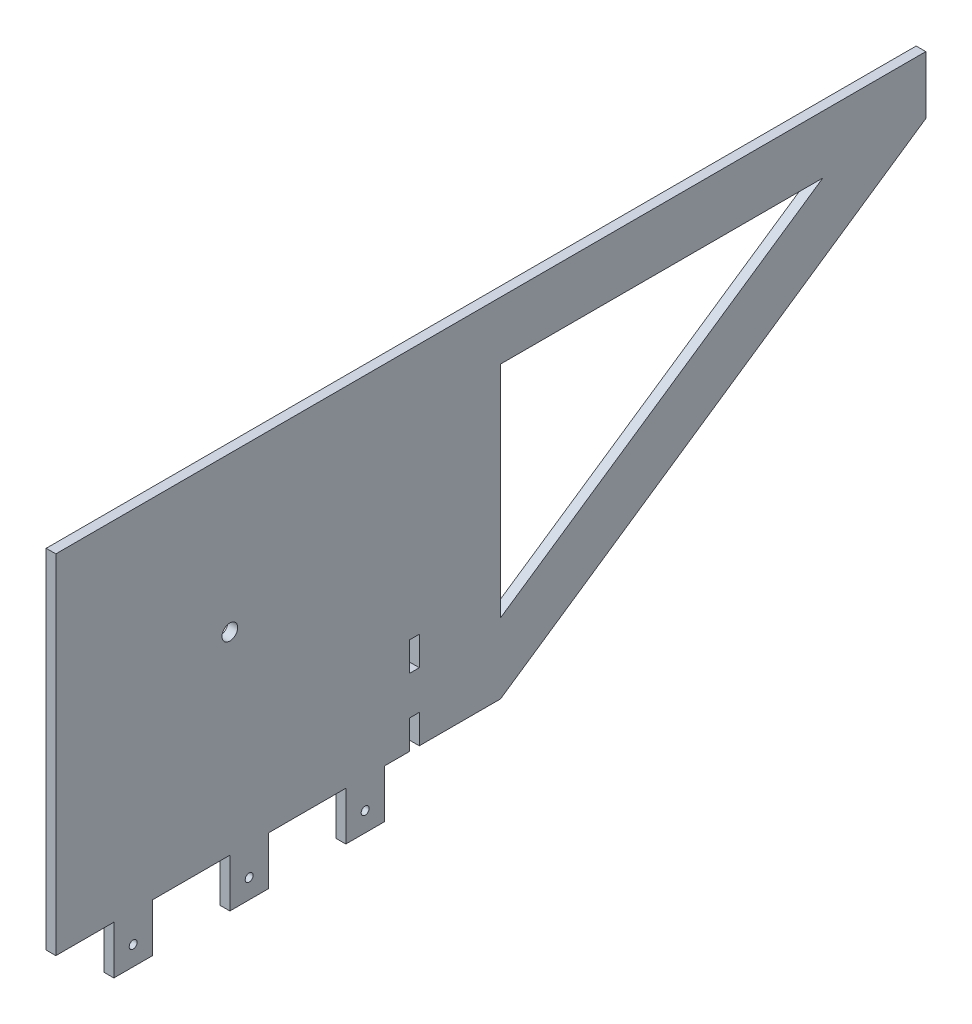
ISO-10303-21;
HEADER;
FILE_DESCRIPTION(('STEP AP214'),'2;1');
FILE_NAME('part.step','',(''),(''),'','','');
FILE_SCHEMA(('AUTOMOTIVE_DESIGN { 1 0 10303 214 1 1 1 1 }'));
ENDSEC;
DATA;
#1=APPLICATION_CONTEXT('core data for automotive mechanical design processes');
#2=APPLICATION_PROTOCOL_DEFINITION('international standard','automotive_design',2000,#1);
#3=PRODUCT_CONTEXT('',#1,'mechanical');
#4=PRODUCT('Part','Part','',(#3));
#5=PRODUCT_RELATED_PRODUCT_CATEGORY('part','',(#4));
#6=PRODUCT_DEFINITION_FORMATION('','',#4);
#7=PRODUCT_DEFINITION_CONTEXT('part definition',#1,'design');
#8=PRODUCT_DEFINITION('design','',#6,#7);
#9=PRODUCT_DEFINITION_SHAPE('','',#8);
#10=(LENGTH_UNIT() NAMED_UNIT(*) SI_UNIT(.MILLI.,.METRE.));
#11=(NAMED_UNIT(*) PLANE_ANGLE_UNIT() SI_UNIT($,.RADIAN.));
#12=(NAMED_UNIT(*) SI_UNIT($,.STERADIAN.) SOLID_ANGLE_UNIT());
#13=UNCERTAINTY_MEASURE_WITH_UNIT(LENGTH_MEASURE(1.E-05),#10,'distance_accuracy_value','');
#14=(GEOMETRIC_REPRESENTATION_CONTEXT(3) GLOBAL_UNCERTAINTY_ASSIGNED_CONTEXT((#13)) GLOBAL_UNIT_ASSIGNED_CONTEXT((#10,
#11,#12)) REPRESENTATION_CONTEXT('',''));
#15=CARTESIAN_POINT('',(0.,0.,0.));
#16=DIRECTION('',(0.,0.,1.));
#17=DIRECTION('',(1.,0.,0.));
#18=AXIS2_PLACEMENT_3D('',#15,#16,#17);
#19=CARTESIAN_POINT('',(5.,-90.,-100.));
#20=DIRECTION('',(0.,1.,0.));
#21=DIRECTION('',(0.,0.,1.));
#22=AXIS2_PLACEMENT_3D('',#19,#20,#21);
#23=PLANE('',#22);
#24=DIRECTION('',(0.,0.,-1.));
#25=VECTOR('',#24,1.);
#26=CARTESIAN_POINT('',(0.,-90.,-100.));
#27=LINE('',#26,#25);
#28=CARTESIAN_POINT('',(0.,-90.,-70.0000000000001));
#29=VERTEX_POINT('',#28);
#30=CARTESIAN_POINT('',(0.,-90.,-83.));
#31=VERTEX_POINT('',#30);
#32=EDGE_CURVE('E416',#29,#31,#27,.T.);
#33=ORIENTED_EDGE('',*,*,#32,.T.);
#34=DIRECTION('',(1.,0.,0.));
#35=VECTOR('',#34,1.);
#36=CARTESIAN_POINT('',(0.,-90.,-83.));
#37=LINE('',#36,#35);
#38=CARTESIAN_POINT('',(5.,-90.,-83.));
#39=VERTEX_POINT('',#38);
#40=EDGE_CURVE('E319',#31,#39,#37,.T.);
#41=ORIENTED_EDGE('',*,*,#40,.T.);
#42=DIRECTION('',(0.,0.,-1.));
#43=VECTOR('',#42,1.);
#44=CARTESIAN_POINT('',(5.,-90.,-100.));
#45=LINE('',#44,#43);
#46=CARTESIAN_POINT('',(5.,-90.,-70.0000000000001));
#47=VERTEX_POINT('',#46);
#48=EDGE_CURVE('E383',#47,#39,#45,.T.);
#49=ORIENTED_EDGE('',*,*,#48,.F.);
#50=DIRECTION('',(-1.,0.,0.));
#51=VECTOR('',#50,1.);
#52=CARTESIAN_POINT('',(5.,-90.,-70.0000000000001));
#53=LINE('',#52,#51);
#54=EDGE_CURVE('E422',#47,#29,#53,.T.);
#55=ORIENTED_EDGE('',*,*,#54,.T.);
#56=EDGE_LOOP('',(#33,#41,#49,#55));
#57=FACE_BOUND('',#56,.T.);
#58=ADVANCED_FACE('F39',(#57),#23,.F.);
#59=CARTESIAN_POINT('',(5.,0.,0.));
#60=DIRECTION('',(-1.,0.,0.));
#61=DIRECTION('',(0.,0.,1.));
#62=AXIS2_PLACEMENT_3D('',#59,#60,#61);
#63=PLANE('',#62);
#64=DIRECTION('',(0.,0.,-1.));
#65=VECTOR('',#64,1.);
#66=CARTESIAN_POINT('',(5.,-55.,-83.));
#67=LINE('',#66,#65);
#68=CARTESIAN_POINT('',(5.,-55.,-83.));
#69=VERTEX_POINT('',#68);
#70=CARTESIAN_POINT('',(5.,-55.,-88.));
#71=VERTEX_POINT('',#70);
#72=EDGE_CURVE('E292',#69,#71,#67,.T.);
#73=ORIENTED_EDGE('',*,*,#72,.F.);
#74=DIRECTION('',(0.,-1.,0.));
#75=VECTOR('',#74,1.);
#76=CARTESIAN_POINT('',(5.,-40.,-83.));
#77=LINE('',#76,#75);
#78=CARTESIAN_POINT('',(5.,-40.,-83.));
#79=VERTEX_POINT('',#78);
#80=EDGE_CURVE('E55',#79,#69,#77,.T.);
#81=ORIENTED_EDGE('',*,*,#80,.F.);
#82=DIRECTION('',(0.,0.,1.));
#83=VECTOR('',#82,1.);
#84=CARTESIAN_POINT('',(5.,-40.,-83.));
#85=LINE('',#84,#83);
#86=CARTESIAN_POINT('',(5.,-40.,-88.));
#87=VERTEX_POINT('',#86);
#88=EDGE_CURVE('E283',#87,#79,#85,.T.);
#89=ORIENTED_EDGE('',*,*,#88,.F.);
#90=DIRECTION('',(0.,1.,0.));
#91=VECTOR('',#90,1.);
#92=CARTESIAN_POINT('',(5.,-40.,-88.));
#93=LINE('',#92,#91);
#94=EDGE_CURVE('E296',#71,#87,#93,.T.);
#95=ORIENTED_EDGE('',*,*,#94,.F.);
#96=EDGE_LOOP('',(#73,#81,#89,#95));
#97=FACE_BOUND('',#96,.T.);
#98=CARTESIAN_POINT('',(5.,10.,9.99999999999999));
#99=DIRECTION('',(1.,0.,0.));
#100=DIRECTION('',(0.,0.,-1.));
#101=AXIS2_PLACEMENT_3D('',#98,#99,#100);
#102=CIRCLE('',#101,4.05);
#103=CARTESIAN_POINT('',(5.,10.,5.94999999999999));
#104=VERTEX_POINT('',#103);
#105=EDGE_CURVE('E303',#104,#104,#102,.T.);
#106=ORIENTED_EDGE('',*,*,#105,.F.);
#107=EDGE_LOOP('',(#106));
#108=FACE_BOUND('',#107,.T.);
#109=ORIENTED_EDGE('',*,*,#48,.T.);
#110=DIRECTION('',(0.,-1.,0.));
#111=VECTOR('',#110,1.);
#112=CARTESIAN_POINT('',(5.,-75.,-83.));
#113=LINE('',#112,#111);
#114=CARTESIAN_POINT('',(5.,-75.,-83.));
#115=VERTEX_POINT('',#114);
#116=EDGE_CURVE('E274',#115,#39,#113,.T.);
#117=ORIENTED_EDGE('',*,*,#116,.F.);
#118=DIRECTION('',(0.,0.,1.));
#119=VECTOR('',#118,1.);
#120=CARTESIAN_POINT('',(5.,-75.,-83.));
#121=LINE('',#120,#119);
#122=CARTESIAN_POINT('',(5.,-75.,-88.));
#123=VERTEX_POINT('',#122);
#124=EDGE_CURVE('E313',#123,#115,#121,.T.);
#125=ORIENTED_EDGE('',*,*,#124,.F.);
#126=DIRECTION('',(0.,1.,0.));
#127=VECTOR('',#126,1.);
#128=CARTESIAN_POINT('',(5.,-75.,-88.));
#129=LINE('',#128,#127);
#130=CARTESIAN_POINT('',(5.,-90.,-88.));
#131=VERTEX_POINT('',#130);
#132=EDGE_CURVE('E321',#131,#123,#129,.T.);
#133=ORIENTED_EDGE('',*,*,#132,.F.);
#134=CARTESIAN_POINT('',(5.,-90.,-130.));
#135=VERTEX_POINT('',#134);
#136=EDGE_CURVE('E382',#131,#135,#45,.T.);
#137=ORIENTED_EDGE('',*,*,#136,.T.);
#138=DIRECTION('',(0.,-0.56333682464151,0.826227342807548));
#139=VECTOR('',#138,1.);
#140=CARTESIAN_POINT('',(5.,60.,-350.));
#141=LINE('',#140,#139);
#142=CARTESIAN_POINT('',(5.,60.,-350.));
#143=VERTEX_POINT('',#142);
#144=EDGE_CURVE('E262',#143,#135,#141,.T.);
#145=ORIENTED_EDGE('',*,*,#144,.F.);
#146=DIRECTION('',(0.,-1.,0.));
#147=VECTOR('',#146,1.);
#148=CARTESIAN_POINT('',(5.,90.,-350.));
#149=LINE('',#148,#147);
#150=CARTESIAN_POINT('',(5.,90.,-350.));
#151=VERTEX_POINT('',#150);
#152=EDGE_CURVE('E259',#151,#143,#149,.T.);
#153=ORIENTED_EDGE('',*,*,#152,.F.);
#154=DIRECTION('',(0.,0.,1.));
#155=VECTOR('',#154,1.);
#156=CARTESIAN_POINT('',(5.,90.,-100.));
#157=LINE('',#156,#155);
#158=CARTESIAN_POINT('',(5.,90.,100.));
#159=VERTEX_POINT('',#158);
#160=EDGE_CURVE('E386',#151,#159,#157,.T.);
#161=ORIENTED_EDGE('',*,*,#160,.T.);
#162=DIRECTION('',(0.,-1.,0.));
#163=VECTOR('',#162,1.);
#164=CARTESIAN_POINT('',(5.,90.,100.));
#165=LINE('',#164,#163);
#166=CARTESIAN_POINT('',(5.,-90.,100.));
#167=VERTEX_POINT('',#166);
#168=EDGE_CURVE('E354',#159,#167,#165,.T.);
#169=ORIENTED_EDGE('',*,*,#168,.T.);
#170=DIRECTION('',(0.,0.,-1.));
#171=VECTOR('',#170,1.);
#172=CARTESIAN_POINT('',(5.,-90.,70.));
#173=LINE('',#172,#171);
#174=CARTESIAN_POINT('',(5.,-90.,70.));
#175=VERTEX_POINT('',#174);
#176=EDGE_CURVE('E357',#167,#175,#173,.T.);
#177=ORIENTED_EDGE('',*,*,#176,.T.);
#178=DIRECTION('',(0.,-1.,0.));
#179=VECTOR('',#178,1.);
#180=CARTESIAN_POINT('',(5.,-90.,70.));
#181=LINE('',#180,#179);
#182=CARTESIAN_POINT('',(5.,-115.,70.));
#183=VERTEX_POINT('',#182);
#184=EDGE_CURVE('E360',#175,#183,#181,.T.);
#185=ORIENTED_EDGE('',*,*,#184,.T.);
#186=DIRECTION('',(0.,0.,-1.));
#187=VECTOR('',#186,1.);
#188=CARTESIAN_POINT('',(5.,-115.,70.));
#189=LINE('',#188,#187);
#190=CARTESIAN_POINT('',(5.,-115.,50.));
#191=VERTEX_POINT('',#190);
#192=EDGE_CURVE('E362',#183,#191,#189,.T.);
#193=ORIENTED_EDGE('',*,*,#192,.T.);
#194=DIRECTION('',(0.,1.,0.));
#195=VECTOR('',#194,1.);
#196=CARTESIAN_POINT('',(5.,-90.,49.9999999999999));
#197=LINE('',#196,#195);
#198=CARTESIAN_POINT('',(5.,-90.,49.9999999999999));
#199=VERTEX_POINT('',#198);
#200=EDGE_CURVE('E364',#191,#199,#197,.T.);
#201=ORIENTED_EDGE('',*,*,#200,.T.);
#202=DIRECTION('',(0.,0.,-1.));
#203=VECTOR('',#202,1.);
#204=CARTESIAN_POINT('',(5.,-90.,9.99999999999995));
#205=LINE('',#204,#203);
#206=CARTESIAN_POINT('',(5.,-90.,9.99999999999995));
#207=VERTEX_POINT('',#206);
#208=EDGE_CURVE('E366',#199,#207,#205,.T.);
#209=ORIENTED_EDGE('',*,*,#208,.T.);
#210=DIRECTION('',(0.,-1.,0.));
#211=VECTOR('',#210,1.);
#212=CARTESIAN_POINT('',(5.,-90.,9.99999999999995));
#213=LINE('',#212,#211);
#214=CARTESIAN_POINT('',(5.,-115.,9.99999999999994));
#215=VERTEX_POINT('',#214);
#216=EDGE_CURVE('E368',#207,#215,#213,.T.);
#217=ORIENTED_EDGE('',*,*,#216,.T.);
#218=DIRECTION('',(0.,0.,-1.));
#219=VECTOR('',#218,1.);
#220=CARTESIAN_POINT('',(5.,-115.,9.99999999999994));
#221=LINE('',#220,#219);
#222=CARTESIAN_POINT('',(5.,-115.,-10.0000000000001));
#223=VERTEX_POINT('',#222);
#224=EDGE_CURVE('E370',#215,#223,#221,.T.);
#225=ORIENTED_EDGE('',*,*,#224,.T.);
#226=DIRECTION('',(0.,1.,0.));
#227=VECTOR('',#226,1.);
#228=CARTESIAN_POINT('',(5.,-90.,-10.0000000000001));
#229=LINE('',#228,#227);
#230=CARTESIAN_POINT('',(5.,-90.,-10.0000000000001));
#231=VERTEX_POINT('',#230);
#232=EDGE_CURVE('E372',#223,#231,#229,.T.);
#233=ORIENTED_EDGE('',*,*,#232,.T.);
#234=DIRECTION('',(0.,0.,-1.));
#235=VECTOR('',#234,1.);
#236=CARTESIAN_POINT('',(5.,-90.,-50.0000000000001));
#237=LINE('',#236,#235);
#238=CARTESIAN_POINT('',(5.,-90.,-50.0000000000001));
#239=VERTEX_POINT('',#238);
#240=EDGE_CURVE('E374',#231,#239,#237,.T.);
#241=ORIENTED_EDGE('',*,*,#240,.T.);
#242=DIRECTION('',(0.,-1.,0.));
#243=VECTOR('',#242,1.);
#244=CARTESIAN_POINT('',(5.,-115.,-50.0000000000001));
#245=LINE('',#244,#243);
#246=CARTESIAN_POINT('',(5.,-115.,-50.0000000000001));
#247=VERTEX_POINT('',#246);
#248=EDGE_CURVE('E376',#239,#247,#245,.T.);
#249=ORIENTED_EDGE('',*,*,#248,.T.);
#250=DIRECTION('',(0.,0.,-1.));
#251=VECTOR('',#250,1.);
#252=CARTESIAN_POINT('',(5.,-115.,-70.0000000000001));
#253=LINE('',#252,#251);
#254=CARTESIAN_POINT('',(5.,-115.,-70.0000000000001));
#255=VERTEX_POINT('',#254);
#256=EDGE_CURVE('E378',#247,#255,#253,.T.);
#257=ORIENTED_EDGE('',*,*,#256,.T.);
#258=DIRECTION('',(0.,1.,0.));
#259=VECTOR('',#258,1.);
#260=CARTESIAN_POINT('',(5.,-115.,-70.0000000000001));
#261=LINE('',#260,#259);
#262=EDGE_CURVE('E380',#255,#47,#261,.T.);
#263=ORIENTED_EDGE('',*,*,#262,.T.);
#264=EDGE_LOOP('',(#109,#117,#125,#133,#137,#145,#153,#161,#169,#177,#185,#193,#201,#209,#217,
#225,#233,#241,#249,#257,#263));
#265=FACE_BOUND('',#264,.T.);
#266=CARTESIAN_POINT('',(5.,-105.,60.));
#267=DIRECTION('',(1.,0.,0.));
#268=DIRECTION('',(0.,0.,-1.));
#269=AXIS2_PLACEMENT_3D('',#266,#267,#268);
#270=CIRCLE('',#269,2.04999999999999);
#271=CARTESIAN_POINT('',(5.,-105.,57.95));
#272=VERTEX_POINT('',#271);
#273=EDGE_CURVE('E348',#272,#272,#270,.T.);
#274=ORIENTED_EDGE('',*,*,#273,.F.);
#275=EDGE_LOOP('',(#274));
#276=FACE_BOUND('',#275,.T.);
#277=CARTESIAN_POINT('',(5.,-105.,0.));
#278=DIRECTION('',(1.,0.,0.));
#279=DIRECTION('',(0.,0.,-1.));
#280=AXIS2_PLACEMENT_3D('',#277,#278,#279);
#281=CIRCLE('',#280,2.05);
#282=CARTESIAN_POINT('',(5.,-105.,-2.05000000000005));
#283=VERTEX_POINT('',#282);
#284=EDGE_CURVE('E342',#283,#283,#281,.T.);
#285=ORIENTED_EDGE('',*,*,#284,.F.);
#286=EDGE_LOOP('',(#285));
#287=FACE_BOUND('',#286,.T.);
#288=CARTESIAN_POINT('',(5.,-105.,-60.0000000000001));
#289=DIRECTION('',(1.,0.,0.));
#290=DIRECTION('',(0.,0.,-1.));
#291=AXIS2_PLACEMENT_3D('',#288,#289,#290);
#292=CIRCLE('',#291,2.04999999999999);
#293=CARTESIAN_POINT('',(5.,-105.,-62.05));
#294=VERTEX_POINT('',#293);
#295=EDGE_CURVE('E335',#294,#294,#292,.T.);
#296=ORIENTED_EDGE('',*,*,#295,.F.);
#297=EDGE_LOOP('',(#296));
#298=FACE_BOUND('',#297,.T.);
#299=DIRECTION('',(0.,1.,0.));
#300=VECTOR('',#299,1.);
#301=CARTESIAN_POINT('',(5.,60.,-130.));
#302=LINE('',#301,#300);
#303=CARTESIAN_POINT('',(5.,-53.6903810299245,-130.));
#304=VERTEX_POINT('',#303);
#305=CARTESIAN_POINT('',(5.,60.,-130.));
#306=VERTEX_POINT('',#305);
#307=EDGE_CURVE('E237',#304,#306,#302,.T.);
#308=ORIENTED_EDGE('',*,*,#307,.T.);
#309=DIRECTION('',(0.,0.,-1.));
#310=VECTOR('',#309,1.);
#311=CARTESIAN_POINT('',(5.,60.,-130.));
#312=LINE('',#311,#310);
#313=CARTESIAN_POINT('',(5.,60.,-296.745892177223));
#314=VERTEX_POINT('',#313);
#315=EDGE_CURVE('E229',#306,#314,#312,.T.);
#316=ORIENTED_EDGE('',*,*,#315,.T.);
#317=DIRECTION('',(0.,-0.56333682464151,0.826227342807548));
#318=VECTOR('',#317,1.);
#319=CARTESIAN_POINT('',(5.,60.,-296.745892177223));
#320=LINE('',#319,#318);
#321=EDGE_CURVE('E241',#314,#304,#320,.T.);
#322=ORIENTED_EDGE('',*,*,#321,.T.);
#323=EDGE_LOOP('',(#308,#316,#322));
#324=FACE_BOUND('',#323,.T.);
#325=ADVANCED_FACE('F245',(#97,#108,#265,#276,#287,#298,#324),#63,.F.);
#326=CARTESIAN_POINT('',(0.,0.,0.));
#327=DIRECTION('',(-1.,0.,0.));
#328=DIRECTION('',(0.,0.,1.));
#329=AXIS2_PLACEMENT_3D('',#326,#327,#328);
#330=PLANE('',#329);
#331=DIRECTION('',(0.,-1.,0.));
#332=VECTOR('',#331,1.);
#333=CARTESIAN_POINT('',(0.,-40.,-83.));
#334=LINE('',#333,#332);
#335=CARTESIAN_POINT('',(0.,-40.,-83.));
#336=VERTEX_POINT('',#335);
#337=CARTESIAN_POINT('',(0.,-55.,-83.));
#338=VERTEX_POINT('',#337);
#339=EDGE_CURVE('E279',#336,#338,#334,.T.);
#340=ORIENTED_EDGE('',*,*,#339,.T.);
#341=DIRECTION('',(0.,0.,-1.));
#342=VECTOR('',#341,1.);
#343=CARTESIAN_POINT('',(0.,-55.,-83.));
#344=LINE('',#343,#342);
#345=CARTESIAN_POINT('',(0.,-55.,-88.));
#346=VERTEX_POINT('',#345);
#347=EDGE_CURVE('E282',#338,#346,#344,.T.);
#348=ORIENTED_EDGE('',*,*,#347,.T.);
#349=DIRECTION('',(0.,1.,0.));
#350=VECTOR('',#349,1.);
#351=CARTESIAN_POINT('',(0.,-40.,-88.));
#352=LINE('',#351,#350);
#353=CARTESIAN_POINT('',(0.,-40.,-88.));
#354=VERTEX_POINT('',#353);
#355=EDGE_CURVE('E63',#346,#354,#352,.T.);
#356=ORIENTED_EDGE('',*,*,#355,.T.);
#357=DIRECTION('',(0.,0.,1.));
#358=VECTOR('',#357,1.);
#359=CARTESIAN_POINT('',(0.,-40.,-83.));
#360=LINE('',#359,#358);
#361=EDGE_CURVE('E287',#354,#336,#360,.T.);
#362=ORIENTED_EDGE('',*,*,#361,.T.);
#363=EDGE_LOOP('',(#340,#348,#356,#362));
#364=FACE_BOUND('',#363,.T.);
#365=DIRECTION('',(0.,-1.,0.));
#366=VECTOR('',#365,1.);
#367=CARTESIAN_POINT('',(0.,-75.,-83.));
#368=LINE('',#367,#366);
#369=CARTESIAN_POINT('',(0.,-75.,-83.));
#370=VERTEX_POINT('',#369);
#371=EDGE_CURVE('E309',#370,#31,#368,.T.);
#372=ORIENTED_EDGE('',*,*,#371,.T.);
#373=ORIENTED_EDGE('',*,*,#32,.F.);
#374=DIRECTION('',(0.,1.,0.));
#375=VECTOR('',#374,1.);
#376=CARTESIAN_POINT('',(0.,-115.,-70.0000000000001));
#377=LINE('',#376,#375);
#378=CARTESIAN_POINT('',(0.,-115.,-70.0000000000001));
#379=VERTEX_POINT('',#378);
#380=EDGE_CURVE('E413',#379,#29,#377,.T.);
#381=ORIENTED_EDGE('',*,*,#380,.F.);
#382=DIRECTION('',(0.,0.,-1.));
#383=VECTOR('',#382,1.);
#384=CARTESIAN_POINT('',(0.,-115.,-70.0000000000001));
#385=LINE('',#384,#383);
#386=CARTESIAN_POINT('',(0.,-115.,-50.0000000000001));
#387=VERTEX_POINT('',#386);
#388=EDGE_CURVE('E411',#387,#379,#385,.T.);
#389=ORIENTED_EDGE('',*,*,#388,.F.);
#390=DIRECTION('',(0.,-1.,0.));
#391=VECTOR('',#390,1.);
#392=CARTESIAN_POINT('',(0.,-115.,-50.0000000000001));
#393=LINE('',#392,#391);
#394=CARTESIAN_POINT('',(0.,-90.,-50.0000000000001));
#395=VERTEX_POINT('',#394);
#396=EDGE_CURVE('E409',#395,#387,#393,.T.);
#397=ORIENTED_EDGE('',*,*,#396,.F.);
#398=DIRECTION('',(0.,0.,-1.));
#399=VECTOR('',#398,1.);
#400=CARTESIAN_POINT('',(0.,-90.,-50.0000000000001));
#401=LINE('',#400,#399);
#402=CARTESIAN_POINT('',(0.,-90.,-10.0000000000001));
#403=VERTEX_POINT('',#402);
#404=EDGE_CURVE('E407',#403,#395,#401,.T.);
#405=ORIENTED_EDGE('',*,*,#404,.F.);
#406=DIRECTION('',(0.,1.,0.));
#407=VECTOR('',#406,1.);
#408=CARTESIAN_POINT('',(0.,-90.,-10.0000000000001));
#409=LINE('',#408,#407);
#410=CARTESIAN_POINT('',(0.,-115.,-10.0000000000001));
#411=VERTEX_POINT('',#410);
#412=EDGE_CURVE('E405',#411,#403,#409,.T.);
#413=ORIENTED_EDGE('',*,*,#412,.F.);
#414=DIRECTION('',(0.,0.,-1.));
#415=VECTOR('',#414,1.);
#416=CARTESIAN_POINT('',(0.,-115.,9.99999999999994));
#417=LINE('',#416,#415);
#418=CARTESIAN_POINT('',(0.,-115.,9.99999999999994));
#419=VERTEX_POINT('',#418);
#420=EDGE_CURVE('E403',#419,#411,#417,.T.);
#421=ORIENTED_EDGE('',*,*,#420,.F.);
#422=DIRECTION('',(0.,-1.,0.));
#423=VECTOR('',#422,1.);
#424=CARTESIAN_POINT('',(0.,-90.,9.99999999999995));
#425=LINE('',#424,#423);
#426=CARTESIAN_POINT('',(0.,-90.,9.99999999999995));
#427=VERTEX_POINT('',#426);
#428=EDGE_CURVE('E401',#427,#419,#425,.T.);
#429=ORIENTED_EDGE('',*,*,#428,.F.);
#430=DIRECTION('',(0.,0.,-1.));
#431=VECTOR('',#430,1.);
#432=CARTESIAN_POINT('',(0.,-90.,9.99999999999995));
#433=LINE('',#432,#431);
#434=CARTESIAN_POINT('',(0.,-90.,49.9999999999999));
#435=VERTEX_POINT('',#434);
#436=EDGE_CURVE('E399',#435,#427,#433,.T.);
#437=ORIENTED_EDGE('',*,*,#436,.F.);
#438=DIRECTION('',(0.,1.,0.));
#439=VECTOR('',#438,1.);
#440=CARTESIAN_POINT('',(0.,-90.,49.9999999999999));
#441=LINE('',#440,#439);
#442=CARTESIAN_POINT('',(0.,-115.,50.));
#443=VERTEX_POINT('',#442);
#444=EDGE_CURVE('E397',#443,#435,#441,.T.);
#445=ORIENTED_EDGE('',*,*,#444,.F.);
#446=DIRECTION('',(0.,0.,-1.));
#447=VECTOR('',#446,1.);
#448=CARTESIAN_POINT('',(0.,-115.,70.));
#449=LINE('',#448,#447);
#450=CARTESIAN_POINT('',(0.,-115.,70.));
#451=VERTEX_POINT('',#450);
#452=EDGE_CURVE('E395',#451,#443,#449,.T.);
#453=ORIENTED_EDGE('',*,*,#452,.F.);
#454=DIRECTION('',(0.,-1.,0.));
#455=VECTOR('',#454,1.);
#456=CARTESIAN_POINT('',(0.,-90.,70.));
#457=LINE('',#456,#455);
#458=CARTESIAN_POINT('',(0.,-90.,70.));
#459=VERTEX_POINT('',#458);
#460=EDGE_CURVE('E393',#459,#451,#457,.T.);
#461=ORIENTED_EDGE('',*,*,#460,.F.);
#462=DIRECTION('',(0.,0.,-1.));
#463=VECTOR('',#462,1.);
#464=CARTESIAN_POINT('',(0.,-90.,70.));
#465=LINE('',#464,#463);
#466=CARTESIAN_POINT('',(0.,-90.,100.));
#467=VERTEX_POINT('',#466);
#468=EDGE_CURVE('E391',#467,#459,#465,.T.);
#469=ORIENTED_EDGE('',*,*,#468,.F.);
#470=DIRECTION('',(0.,-1.,0.));
#471=VECTOR('',#470,1.);
#472=CARTESIAN_POINT('',(0.,90.,100.));
#473=LINE('',#472,#471);
#474=CARTESIAN_POINT('',(0.,90.,100.));
#475=VERTEX_POINT('',#474);
#476=EDGE_CURVE('E351',#475,#467,#473,.T.);
#477=ORIENTED_EDGE('',*,*,#476,.F.);
#478=DIRECTION('',(0.,0.,1.));
#479=VECTOR('',#478,1.);
#480=CARTESIAN_POINT('',(0.,90.,-100.));
#481=LINE('',#480,#479);
#482=CARTESIAN_POINT('',(0.,90.,-350.));
#483=VERTEX_POINT('',#482);
#484=EDGE_CURVE('E358',#483,#475,#481,.T.);
#485=ORIENTED_EDGE('',*,*,#484,.F.);
#486=DIRECTION('',(0.,-1.,0.));
#487=VECTOR('',#486,1.);
#488=CARTESIAN_POINT('',(0.,90.,-350.));
#489=LINE('',#488,#487);
#490=CARTESIAN_POINT('',(0.,60.,-350.));
#491=VERTEX_POINT('',#490);
#492=EDGE_CURVE('E257',#483,#491,#489,.T.);
#493=ORIENTED_EDGE('',*,*,#492,.T.);
#494=DIRECTION('',(0.,-0.56333682464151,0.826227342807548));
#495=VECTOR('',#494,1.);
#496=CARTESIAN_POINT('',(0.,60.,-350.));
#497=LINE('',#496,#495);
#498=CARTESIAN_POINT('',(0.,-90.,-130.));
#499=VERTEX_POINT('',#498);
#500=EDGE_CURVE('E263',#491,#499,#497,.T.);
#501=ORIENTED_EDGE('',*,*,#500,.T.);
#502=CARTESIAN_POINT('',(0.,-90.,-88.));
#503=VERTEX_POINT('',#502);
#504=EDGE_CURVE('E415',#503,#499,#27,.T.);
#505=ORIENTED_EDGE('',*,*,#504,.F.);
#506=DIRECTION('',(0.,1.,0.));
#507=VECTOR('',#506,1.);
#508=CARTESIAN_POINT('',(0.,-75.,-88.));
#509=LINE('',#508,#507);
#510=CARTESIAN_POINT('',(0.,-75.,-88.));
#511=VERTEX_POINT('',#510);
#512=EDGE_CURVE('E312',#503,#511,#509,.T.);
#513=ORIENTED_EDGE('',*,*,#512,.T.);
#514=DIRECTION('',(0.,0.,1.));
#515=VECTOR('',#514,1.);
#516=CARTESIAN_POINT('',(0.,-75.,-83.));
#517=LINE('',#516,#515);
#518=EDGE_CURVE('E316',#511,#370,#517,.T.);
#519=ORIENTED_EDGE('',*,*,#518,.T.);
#520=EDGE_LOOP('',(#372,#373,#381,#389,#397,#405,#413,#421,#429,#437,#445,#453,#461,#469,#477,
#485,#493,#501,#505,#513,#519));
#521=FACE_BOUND('',#520,.T.);
#522=CARTESIAN_POINT('',(0.,10.,9.99999999999999));
#523=DIRECTION('',(-1.,0.,0.));
#524=DIRECTION('',(0.,0.,1.));
#525=AXIS2_PLACEMENT_3D('',#522,#523,#524);
#526=CIRCLE('',#525,4.05);
#527=CARTESIAN_POINT('',(0.,10.,14.05));
#528=VERTEX_POINT('',#527);
#529=EDGE_CURVE('E43',#528,#528,#526,.T.);
#530=ORIENTED_EDGE('',*,*,#529,.F.);
#531=EDGE_LOOP('',(#530));
#532=FACE_BOUND('',#531,.T.);
#533=CARTESIAN_POINT('',(0.,-105.,0.));
#534=DIRECTION('',(1.,0.,0.));
#535=DIRECTION('',(0.,0.,-1.));
#536=AXIS2_PLACEMENT_3D('',#533,#534,#535);
#537=CIRCLE('',#536,2.05);
#538=CARTESIAN_POINT('',(0.,-105.,-2.05000000000005));
#539=VERTEX_POINT('',#538);
#540=EDGE_CURVE('E338',#539,#539,#537,.T.);
#541=ORIENTED_EDGE('',*,*,#540,.T.);
#542=EDGE_LOOP('',(#541));
#543=FACE_BOUND('',#542,.T.);
#544=CARTESIAN_POINT('',(0.,-105.,60.));
#545=DIRECTION('',(1.,0.,0.));
#546=DIRECTION('',(0.,0.,-1.));
#547=AXIS2_PLACEMENT_3D('',#544,#545,#546);
#548=CIRCLE('',#547,2.04999999999999);
#549=CARTESIAN_POINT('',(0.,-105.,57.95));
#550=VERTEX_POINT('',#549);
#551=EDGE_CURVE('E345',#550,#550,#548,.T.);
#552=ORIENTED_EDGE('',*,*,#551,.T.);
#553=EDGE_LOOP('',(#552));
#554=FACE_BOUND('',#553,.T.);
#555=CARTESIAN_POINT('',(0.,-105.,-60.0000000000001));
#556=DIRECTION('',(1.,0.,0.));
#557=DIRECTION('',(0.,0.,-1.));
#558=AXIS2_PLACEMENT_3D('',#555,#556,#557);
#559=CIRCLE('',#558,2.04999999999999);
#560=CARTESIAN_POINT('',(0.,-105.,-62.05));
#561=VERTEX_POINT('',#560);
#562=EDGE_CURVE('E339',#561,#561,#559,.T.);
#563=ORIENTED_EDGE('',*,*,#562,.T.);
#564=EDGE_LOOP('',(#563));
#565=FACE_BOUND('',#564,.T.);
#566=DIRECTION('',(0.,0.,-1.));
#567=VECTOR('',#566,1.);
#568=CARTESIAN_POINT('',(0.,60.,-130.));
#569=LINE('',#568,#567);
#570=CARTESIAN_POINT('',(0.,60.,-130.));
#571=VERTEX_POINT('',#570);
#572=CARTESIAN_POINT('',(0.,60.,-296.745892177223));
#573=VERTEX_POINT('',#572);
#574=EDGE_CURVE('E232',#571,#573,#569,.T.);
#575=ORIENTED_EDGE('',*,*,#574,.F.);
#576=DIRECTION('',(0.,1.,0.));
#577=VECTOR('',#576,1.);
#578=CARTESIAN_POINT('',(0.,60.,-130.));
#579=LINE('',#578,#577);
#580=CARTESIAN_POINT('',(0.,-53.6903810299245,-130.));
#581=VERTEX_POINT('',#580);
#582=EDGE_CURVE('E246',#581,#571,#579,.T.);
#583=ORIENTED_EDGE('',*,*,#582,.F.);
#584=DIRECTION('',(0.,-0.56333682464151,0.826227342807548));
#585=VECTOR('',#584,1.);
#586=CARTESIAN_POINT('',(0.,60.,-296.745892177223));
#587=LINE('',#586,#585);
#588=EDGE_CURVE('E249',#573,#581,#587,.T.);
#589=ORIENTED_EDGE('',*,*,#588,.F.);
#590=EDGE_LOOP('',(#575,#583,#589));
#591=FACE_BOUND('',#590,.T.);
#592=ADVANCED_FACE('F465',(#364,#521,#532,#543,#554,#565,#591),#330,.T.);
#593=CARTESIAN_POINT('',(5.,90.,100.));
#594=DIRECTION('',(0.,0.,-1.));
#595=DIRECTION('',(-1.,0.,0.));
#596=AXIS2_PLACEMENT_3D('',#593,#594,#595);
#597=PLANE('',#596);
#598=ORIENTED_EDGE('',*,*,#476,.T.);
#599=DIRECTION('',(-1.,0.,0.));
#600=VECTOR('',#599,1.);
#601=CARTESIAN_POINT('',(5.,-90.,100.));
#602=LINE('',#601,#600);
#603=EDGE_CURVE('E11',#167,#467,#602,.T.);
#604=ORIENTED_EDGE('',*,*,#603,.F.);
#605=ORIENTED_EDGE('',*,*,#168,.F.);
#606=DIRECTION('',(-1.,0.,0.));
#607=VECTOR('',#606,1.);
#608=CARTESIAN_POINT('',(5.,90.,100.));
#609=LINE('',#608,#607);
#610=EDGE_CURVE('E388',#159,#475,#609,.T.);
#611=ORIENTED_EDGE('',*,*,#610,.T.);
#612=EDGE_LOOP('',(#598,#604,#605,#611));
#613=FACE_BOUND('',#612,.T.);
#614=ADVANCED_FACE('F41',(#613),#597,.F.);
#615=CARTESIAN_POINT('',(5.,-90.,70.));
#616=DIRECTION('',(0.,1.,0.));
#617=DIRECTION('',(0.,0.,1.));
#618=AXIS2_PLACEMENT_3D('',#615,#616,#617);
#619=PLANE('',#618);
#620=ORIENTED_EDGE('',*,*,#468,.T.);
#621=DIRECTION('',(-1.,0.,0.));
#622=VECTOR('',#621,1.);
#623=CARTESIAN_POINT('',(5.,-90.,70.));
#624=LINE('',#623,#622);
#625=EDGE_CURVE('E48',#175,#459,#624,.T.);
#626=ORIENTED_EDGE('',*,*,#625,.F.);
#627=ORIENTED_EDGE('',*,*,#176,.F.);
#628=ORIENTED_EDGE('',*,*,#603,.T.);
#629=EDGE_LOOP('',(#620,#626,#627,#628));
#630=FACE_BOUND('',#629,.T.);
#631=ADVANCED_FACE('F484',(#630),#619,.F.);
#632=CARTESIAN_POINT('',(5.,-90.,70.));
#633=DIRECTION('',(0.,0.,-1.));
#634=DIRECTION('',(-1.,0.,0.));
#635=AXIS2_PLACEMENT_3D('',#632,#633,#634);
#636=PLANE('',#635);
#637=ORIENTED_EDGE('',*,*,#460,.T.);
#638=DIRECTION('',(-1.,0.,0.));
#639=VECTOR('',#638,1.);
#640=CARTESIAN_POINT('',(5.,-115.,70.));
#641=LINE('',#640,#639);
#642=EDGE_CURVE('E452',#183,#451,#641,.T.);
#643=ORIENTED_EDGE('',*,*,#642,.F.);
#644=ORIENTED_EDGE('',*,*,#184,.F.);
#645=ORIENTED_EDGE('',*,*,#625,.T.);
#646=EDGE_LOOP('',(#637,#643,#644,#645));
#647=FACE_BOUND('',#646,.T.);
#648=ADVANCED_FACE('F460',(#647),#636,.F.);
#649=CARTESIAN_POINT('',(5.,-115.,70.));
#650=DIRECTION('',(0.,1.,0.));
#651=DIRECTION('',(0.,0.,1.));
#652=AXIS2_PLACEMENT_3D('',#649,#650,#651);
#653=PLANE('',#652);
#654=ORIENTED_EDGE('',*,*,#452,.T.);
#655=DIRECTION('',(-1.,0.,0.));
#656=VECTOR('',#655,1.);
#657=CARTESIAN_POINT('',(5.,-115.,50.));
#658=LINE('',#657,#656);
#659=EDGE_CURVE('E449',#191,#443,#658,.T.);
#660=ORIENTED_EDGE('',*,*,#659,.F.);
#661=ORIENTED_EDGE('',*,*,#192,.F.);
#662=ORIENTED_EDGE('',*,*,#642,.T.);
#663=EDGE_LOOP('',(#654,#660,#661,#662));
#664=FACE_BOUND('',#663,.T.);
#665=ADVANCED_FACE('F472',(#664),#653,.F.);
#666=CARTESIAN_POINT('',(5.,-90.,49.9999999999999));
#667=DIRECTION('',(0.,0.,1.));
#668=DIRECTION('',(0.,-1.,0.));
#669=AXIS2_PLACEMENT_3D('',#666,#667,#668);
#670=PLANE('',#669);
#671=ORIENTED_EDGE('',*,*,#444,.T.);
#672=DIRECTION('',(-1.,0.,0.));
#673=VECTOR('',#672,1.);
#674=CARTESIAN_POINT('',(5.,-90.,49.9999999999999));
#675=LINE('',#674,#673);
#676=EDGE_CURVE('E446',#199,#435,#675,.T.);
#677=ORIENTED_EDGE('',*,*,#676,.F.);
#678=ORIENTED_EDGE('',*,*,#200,.F.);
#679=ORIENTED_EDGE('',*,*,#659,.T.);
#680=EDGE_LOOP('',(#671,#677,#678,#679));
#681=FACE_BOUND('',#680,.T.);
#682=ADVANCED_FACE('F476',(#681),#670,.F.);
#683=CARTESIAN_POINT('',(5.,-90.,9.99999999999995));
#684=DIRECTION('',(0.,1.,0.));
#685=DIRECTION('',(0.,0.,1.));
#686=AXIS2_PLACEMENT_3D('',#683,#684,#685);
#687=PLANE('',#686);
#688=ORIENTED_EDGE('',*,*,#436,.T.);
#689=DIRECTION('',(-1.,0.,0.));
#690=VECTOR('',#689,1.);
#691=CARTESIAN_POINT('',(5.,-90.,9.99999999999995));
#692=LINE('',#691,#690);
#693=EDGE_CURVE('E443',#207,#427,#692,.T.);
#694=ORIENTED_EDGE('',*,*,#693,.F.);
#695=ORIENTED_EDGE('',*,*,#208,.F.);
#696=ORIENTED_EDGE('',*,*,#676,.T.);
#697=EDGE_LOOP('',(#688,#694,#695,#696));
#698=FACE_BOUND('',#697,.T.);
#699=ADVANCED_FACE('F553',(#698),#687,.F.);
#700=CARTESIAN_POINT('',(5.,-90.,9.99999999999995));
#701=DIRECTION('',(0.,0.,-1.));
#702=DIRECTION('',(0.,1.,0.));
#703=AXIS2_PLACEMENT_3D('',#700,#701,#702);
#704=PLANE('',#703);
#705=ORIENTED_EDGE('',*,*,#428,.T.);
#706=DIRECTION('',(-1.,0.,0.));
#707=VECTOR('',#706,1.);
#708=CARTESIAN_POINT('',(5.,-115.,9.99999999999994));
#709=LINE('',#708,#707);
#710=EDGE_CURVE('E440',#215,#419,#709,.T.);
#711=ORIENTED_EDGE('',*,*,#710,.F.);
#712=ORIENTED_EDGE('',*,*,#216,.F.);
#713=ORIENTED_EDGE('',*,*,#693,.T.);
#714=EDGE_LOOP('',(#705,#711,#712,#713));
#715=FACE_BOUND('',#714,.T.);
#716=ADVANCED_FACE('F551',(#715),#704,.F.);
#717=CARTESIAN_POINT('',(5.,-115.,9.99999999999994));
#718=DIRECTION('',(0.,1.,0.));
#719=DIRECTION('',(0.,0.,1.));
#720=AXIS2_PLACEMENT_3D('',#717,#718,#719);
#721=PLANE('',#720);
#722=ORIENTED_EDGE('',*,*,#420,.T.);
#723=DIRECTION('',(-1.,0.,0.));
#724=VECTOR('',#723,1.);
#725=CARTESIAN_POINT('',(5.,-115.,-10.0000000000001));
#726=LINE('',#725,#724);
#727=EDGE_CURVE('E437',#223,#411,#726,.T.);
#728=ORIENTED_EDGE('',*,*,#727,.F.);
#729=ORIENTED_EDGE('',*,*,#224,.F.);
#730=ORIENTED_EDGE('',*,*,#710,.T.);
#731=EDGE_LOOP('',(#722,#728,#729,#730));
#732=FACE_BOUND('',#731,.T.);
#733=ADVANCED_FACE('F547',(#732),#721,.F.);
#734=CARTESIAN_POINT('',(5.,-90.,-10.0000000000001));
#735=DIRECTION('',(0.,0.,1.));
#736=DIRECTION('',(0.,-1.,0.));
#737=AXIS2_PLACEMENT_3D('',#734,#735,#736);
#738=PLANE('',#737);
#739=ORIENTED_EDGE('',*,*,#412,.T.);
#740=DIRECTION('',(-1.,0.,0.));
#741=VECTOR('',#740,1.);
#742=CARTESIAN_POINT('',(5.,-90.,-10.0000000000001));
#743=LINE('',#742,#741);
#744=EDGE_CURVE('E434',#231,#403,#743,.T.);
#745=ORIENTED_EDGE('',*,*,#744,.F.);
#746=ORIENTED_EDGE('',*,*,#232,.F.);
#747=ORIENTED_EDGE('',*,*,#727,.T.);
#748=EDGE_LOOP('',(#739,#745,#746,#747));
#749=FACE_BOUND('',#748,.T.);
#750=ADVANCED_FACE('F542',(#749),#738,.F.);
#751=CARTESIAN_POINT('',(5.,-90.,-50.0000000000001));
#752=DIRECTION('',(0.,1.,0.));
#753=DIRECTION('',(0.,0.,1.));
#754=AXIS2_PLACEMENT_3D('',#751,#752,#753);
#755=PLANE('',#754);
#756=ORIENTED_EDGE('',*,*,#404,.T.);
#757=DIRECTION('',(-1.,0.,0.));
#758=VECTOR('',#757,1.);
#759=CARTESIAN_POINT('',(5.,-90.,-50.0000000000001));
#760=LINE('',#759,#758);
#761=EDGE_CURVE('E431',#239,#395,#760,.T.);
#762=ORIENTED_EDGE('',*,*,#761,.F.);
#763=ORIENTED_EDGE('',*,*,#240,.F.);
#764=ORIENTED_EDGE('',*,*,#744,.T.);
#765=EDGE_LOOP('',(#756,#762,#763,#764));
#766=FACE_BOUND('',#765,.T.);
#767=ADVANCED_FACE('F536',(#766),#755,.F.);
#768=CARTESIAN_POINT('',(5.,-115.,-50.0000000000001));
#769=DIRECTION('',(0.,0.,-1.));
#770=DIRECTION('',(-1.,0.,0.));
#771=AXIS2_PLACEMENT_3D('',#768,#769,#770);
#772=PLANE('',#771);
#773=ORIENTED_EDGE('',*,*,#396,.T.);
#774=DIRECTION('',(-1.,0.,0.));
#775=VECTOR('',#774,1.);
#776=CARTESIAN_POINT('',(5.,-115.,-50.0000000000001));
#777=LINE('',#776,#775);
#778=EDGE_CURVE('E428',#247,#387,#777,.T.);
#779=ORIENTED_EDGE('',*,*,#778,.F.);
#780=ORIENTED_EDGE('',*,*,#248,.F.);
#781=ORIENTED_EDGE('',*,*,#761,.T.);
#782=EDGE_LOOP('',(#773,#779,#780,#781));
#783=FACE_BOUND('',#782,.T.);
#784=ADVANCED_FACE('F532',(#783),#772,.F.);
#785=CARTESIAN_POINT('',(5.,-115.,-70.0000000000001));
#786=DIRECTION('',(0.,1.,0.));
#787=DIRECTION('',(0.,0.,1.));
#788=AXIS2_PLACEMENT_3D('',#785,#786,#787);
#789=PLANE('',#788);
#790=ORIENTED_EDGE('',*,*,#388,.T.);
#791=DIRECTION('',(-1.,0.,0.));
#792=VECTOR('',#791,1.);
#793=CARTESIAN_POINT('',(5.,-115.,-70.0000000000001));
#794=LINE('',#793,#792);
#795=EDGE_CURVE('E425',#255,#379,#794,.T.);
#796=ORIENTED_EDGE('',*,*,#795,.F.);
#797=ORIENTED_EDGE('',*,*,#256,.F.);
#798=ORIENTED_EDGE('',*,*,#778,.T.);
#799=EDGE_LOOP('',(#790,#796,#797,#798));
#800=FACE_BOUND('',#799,.T.);
#801=ADVANCED_FACE('F527',(#800),#789,.F.);
#802=CARTESIAN_POINT('',(5.,-115.,-70.0000000000001));
#803=DIRECTION('',(0.,0.,1.));
#804=DIRECTION('',(1.,0.,0.));
#805=AXIS2_PLACEMENT_3D('',#802,#803,#804);
#806=PLANE('',#805);
#807=ORIENTED_EDGE('',*,*,#380,.T.);
#808=ORIENTED_EDGE('',*,*,#54,.F.);
#809=ORIENTED_EDGE('',*,*,#262,.F.);
#810=ORIENTED_EDGE('',*,*,#795,.T.);
#811=EDGE_LOOP('',(#807,#808,#809,#810));
#812=FACE_BOUND('',#811,.T.);
#813=ADVANCED_FACE('F521',(#812),#806,.F.);
#814=ORIENTED_EDGE('',*,*,#136,.F.);
#815=DIRECTION('',(1.,0.,0.));
#816=VECTOR('',#815,1.);
#817=CARTESIAN_POINT('',(0.,-90.,-88.));
#818=LINE('',#817,#816);
#819=EDGE_CURVE('E329',#503,#131,#818,.T.);
#820=ORIENTED_EDGE('',*,*,#819,.F.);
#821=ORIENTED_EDGE('',*,*,#504,.T.);
#822=DIRECTION('',(-1.,0.,0.));
#823=VECTOR('',#822,1.);
#824=CARTESIAN_POINT('',(5.,-90.,-130.));
#825=LINE('',#824,#823);
#826=EDGE_CURVE('E271',#135,#499,#825,.T.);
#827=ORIENTED_EDGE('',*,*,#826,.F.);
#828=EDGE_LOOP('',(#814,#820,#821,#827));
#829=FACE_BOUND('',#828,.T.);
#830=ADVANCED_FACE('F503',(#829),#23,.F.);
#831=CARTESIAN_POINT('',(5.,90.,-100.));
#832=DIRECTION('',(0.,-1.,0.));
#833=DIRECTION('',(0.,0.,-1.));
#834=AXIS2_PLACEMENT_3D('',#831,#832,#833);
#835=PLANE('',#834);
#836=ORIENTED_EDGE('',*,*,#484,.T.);
#837=ORIENTED_EDGE('',*,*,#610,.F.);
#838=ORIENTED_EDGE('',*,*,#160,.F.);
#839=DIRECTION('',(-1.,0.,0.));
#840=VECTOR('',#839,1.);
#841=CARTESIAN_POINT('',(5.,90.,-350.));
#842=LINE('',#841,#840);
#843=EDGE_CURVE('E266',#151,#483,#842,.T.);
#844=ORIENTED_EDGE('',*,*,#843,.T.);
#845=EDGE_LOOP('',(#836,#837,#838,#844));
#846=FACE_BOUND('',#845,.T.);
#847=ADVANCED_FACE('F490',(#846),#835,.F.);
#848=CARTESIAN_POINT('',(5.,-105.,60.));
#849=DIRECTION('',(-1.,0.,0.));
#850=DIRECTION('',(0.,0.,1.));
#851=AXIS2_PLACEMENT_3D('',#848,#849,#850);
#852=CYLINDRICAL_SURFACE('',#851,2.04999999999999);
#853=ORIENTED_EDGE('',*,*,#273,.T.);
#854=EDGE_LOOP('',(#853));
#855=FACE_BOUND('',#854,.T.);
#856=ORIENTED_EDGE('',*,*,#551,.F.);
#857=EDGE_LOOP('',(#856));
#858=FACE_BOUND('',#857,.T.);
#859=ADVANCED_FACE('F578',(#855,#858),#852,.F.);
#860=CARTESIAN_POINT('',(5.,-105.,0.));
#861=DIRECTION('',(-1.,0.,0.));
#862=DIRECTION('',(0.,0.,1.));
#863=AXIS2_PLACEMENT_3D('',#860,#861,#862);
#864=CYLINDRICAL_SURFACE('',#863,2.05);
#865=ORIENTED_EDGE('',*,*,#284,.T.);
#866=EDGE_LOOP('',(#865));
#867=FACE_BOUND('',#866,.T.);
#868=ORIENTED_EDGE('',*,*,#540,.F.);
#869=EDGE_LOOP('',(#868));
#870=FACE_BOUND('',#869,.T.);
#871=ADVANCED_FACE('F626',(#867,#870),#864,.F.);
#872=CARTESIAN_POINT('',(5.,-105.,-60.0000000000001));
#873=DIRECTION('',(-1.,0.,0.));
#874=DIRECTION('',(0.,0.,1.));
#875=AXIS2_PLACEMENT_3D('',#872,#873,#874);
#876=CYLINDRICAL_SURFACE('',#875,2.04999999999999);
#877=ORIENTED_EDGE('',*,*,#295,.T.);
#878=EDGE_LOOP('',(#877));
#879=FACE_BOUND('',#878,.T.);
#880=ORIENTED_EDGE('',*,*,#562,.F.);
#881=EDGE_LOOP('',(#880));
#882=FACE_BOUND('',#881,.T.);
#883=ADVANCED_FACE('F637',(#879,#882),#876,.F.);
#884=CARTESIAN_POINT('',(-5.,10.,9.99999999999999));
#885=DIRECTION('',(1.,0.,0.));
#886=DIRECTION('',(0.,0.,-1.));
#887=AXIS2_PLACEMENT_3D('',#884,#885,#886);
#888=CYLINDRICAL_SURFACE('',#887,4.05);
#889=ORIENTED_EDGE('',*,*,#529,.T.);
#890=EDGE_LOOP('',(#889));
#891=FACE_BOUND('',#890,.T.);
#892=ORIENTED_EDGE('',*,*,#105,.T.);
#893=EDGE_LOOP('',(#892));
#894=FACE_BOUND('',#893,.T.);
#895=ADVANCED_FACE('F646',(#891,#894),#888,.F.);
#896=CARTESIAN_POINT('',(0.,-75.,-83.));
#897=DIRECTION('',(0.,0.,1.));
#898=DIRECTION('',(0.,-1.,0.));
#899=AXIS2_PLACEMENT_3D('',#896,#897,#898);
#900=PLANE('',#899);
#901=ORIENTED_EDGE('',*,*,#116,.T.);
#902=ORIENTED_EDGE('',*,*,#40,.F.);
#903=ORIENTED_EDGE('',*,*,#371,.F.);
#904=DIRECTION('',(1.,0.,0.));
#905=VECTOR('',#904,1.);
#906=CARTESIAN_POINT('',(0.,-75.,-83.));
#907=LINE('',#906,#905);
#908=EDGE_CURVE('E293',#370,#115,#907,.T.);
#909=ORIENTED_EDGE('',*,*,#908,.T.);
#910=EDGE_LOOP('',(#901,#902,#903,#909));
#911=FACE_BOUND('',#910,.T.);
#912=ADVANCED_FACE('F655',(#911),#900,.F.);
#913=CARTESIAN_POINT('',(0.,-75.,-83.));
#914=DIRECTION('',(0.,1.,0.));
#915=DIRECTION('',(0.,0.,1.));
#916=AXIS2_PLACEMENT_3D('',#913,#914,#915);
#917=PLANE('',#916);
#918=ORIENTED_EDGE('',*,*,#124,.T.);
#919=ORIENTED_EDGE('',*,*,#908,.F.);
#920=ORIENTED_EDGE('',*,*,#518,.F.);
#921=DIRECTION('',(1.,0.,0.));
#922=VECTOR('',#921,1.);
#923=CARTESIAN_POINT('',(0.,-75.,-88.));
#924=LINE('',#923,#922);
#925=EDGE_CURVE('E327',#511,#123,#924,.T.);
#926=ORIENTED_EDGE('',*,*,#925,.T.);
#927=EDGE_LOOP('',(#918,#919,#920,#926));
#928=FACE_BOUND('',#927,.T.);
#929=ADVANCED_FACE('F510',(#928),#917,.F.);
#930=CARTESIAN_POINT('',(0.,-75.,-88.));
#931=DIRECTION('',(0.,0.,-1.));
#932=DIRECTION('',(-1.,0.,0.));
#933=AXIS2_PLACEMENT_3D('',#930,#931,#932);
#934=PLANE('',#933);
#935=ORIENTED_EDGE('',*,*,#132,.T.);
#936=ORIENTED_EDGE('',*,*,#925,.F.);
#937=ORIENTED_EDGE('',*,*,#512,.F.);
#938=ORIENTED_EDGE('',*,*,#819,.T.);
#939=EDGE_LOOP('',(#935,#936,#937,#938));
#940=FACE_BOUND('',#939,.T.);
#941=ADVANCED_FACE('F506',(#940),#934,.F.);
#942=CARTESIAN_POINT('',(0.,-40.,-83.));
#943=DIRECTION('',(0.,0.,1.));
#944=DIRECTION('',(0.,-1.,0.));
#945=AXIS2_PLACEMENT_3D('',#942,#943,#944);
#946=PLANE('',#945);
#947=ORIENTED_EDGE('',*,*,#80,.T.);
#948=DIRECTION('',(1.,0.,0.));
#949=VECTOR('',#948,1.);
#950=CARTESIAN_POINT('',(0.,-55.,-83.));
#951=LINE('',#950,#949);
#952=EDGE_CURVE('E290',#338,#69,#951,.T.);
#953=ORIENTED_EDGE('',*,*,#952,.F.);
#954=ORIENTED_EDGE('',*,*,#339,.F.);
#955=DIRECTION('',(1.,0.,0.));
#956=VECTOR('',#955,1.);
#957=CARTESIAN_POINT('',(0.,-40.,-83.));
#958=LINE('',#957,#956);
#959=EDGE_CURVE('E301',#336,#79,#958,.T.);
#960=ORIENTED_EDGE('',*,*,#959,.T.);
#961=EDGE_LOOP('',(#947,#953,#954,#960));
#962=FACE_BOUND('',#961,.T.);
#963=ADVANCED_FACE('F680',(#962),#946,.F.);
#964=CARTESIAN_POINT('',(0.,-40.,-83.));
#965=DIRECTION('',(0.,1.,0.));
#966=DIRECTION('',(0.,0.,1.));
#967=AXIS2_PLACEMENT_3D('',#964,#965,#966);
#968=PLANE('',#967);
#969=ORIENTED_EDGE('',*,*,#88,.T.);
#970=ORIENTED_EDGE('',*,*,#959,.F.);
#971=ORIENTED_EDGE('',*,*,#361,.F.);
#972=DIRECTION('',(1.,0.,0.));
#973=VECTOR('',#972,1.);
#974=CARTESIAN_POINT('',(0.,-40.,-88.));
#975=LINE('',#974,#973);
#976=EDGE_CURVE('E304',#354,#87,#975,.T.);
#977=ORIENTED_EDGE('',*,*,#976,.T.);
#978=EDGE_LOOP('',(#969,#970,#971,#977));
#979=FACE_BOUND('',#978,.T.);
#980=ADVANCED_FACE('F687',(#979),#968,.F.);
#981=CARTESIAN_POINT('',(0.,-40.,-88.));
#982=DIRECTION('',(0.,0.,-1.));
#983=DIRECTION('',(-1.,0.,0.));
#984=AXIS2_PLACEMENT_3D('',#981,#982,#983);
#985=PLANE('',#984);
#986=ORIENTED_EDGE('',*,*,#94,.T.);
#987=ORIENTED_EDGE('',*,*,#976,.F.);
#988=ORIENTED_EDGE('',*,*,#355,.F.);
#989=DIRECTION('',(1.,0.,0.));
#990=VECTOR('',#989,1.);
#991=CARTESIAN_POINT('',(0.,-55.,-88.));
#992=LINE('',#991,#990);
#993=EDGE_CURVE('E306',#346,#71,#992,.T.);
#994=ORIENTED_EDGE('',*,*,#993,.T.);
#995=EDGE_LOOP('',(#986,#987,#988,#994));
#996=FACE_BOUND('',#995,.T.);
#997=ADVANCED_FACE('F694',(#996),#985,.F.);
#998=CARTESIAN_POINT('',(0.,-55.,-83.));
#999=DIRECTION('',(0.,-1.,0.));
#1000=DIRECTION('',(0.,0.,-1.));
#1001=AXIS2_PLACEMENT_3D('',#998,#999,#1000);
#1002=PLANE('',#1001);
#1003=ORIENTED_EDGE('',*,*,#72,.T.);
#1004=ORIENTED_EDGE('',*,*,#993,.F.);
#1005=ORIENTED_EDGE('',*,*,#347,.F.);
#1006=ORIENTED_EDGE('',*,*,#952,.T.);
#1007=EDGE_LOOP('',(#1003,#1004,#1005,#1006));
#1008=FACE_BOUND('',#1007,.T.);
#1009=ADVANCED_FACE('F702',(#1008),#1002,.F.);
#1010=CARTESIAN_POINT('',(5.,60.,-350.));
#1011=DIRECTION('',(0.,-0.826227342807548,-0.56333682464151));
#1012=DIRECTION('',(0.,0.56333682464151,-0.826227342807548));
#1013=AXIS2_PLACEMENT_3D('',#1010,#1011,#1012);
#1014=PLANE('',#1013);
#1015=ORIENTED_EDGE('',*,*,#500,.F.);
#1016=DIRECTION('',(-1.,0.,0.));
#1017=VECTOR('',#1016,1.);
#1018=CARTESIAN_POINT('',(5.,60.,-350.));
#1019=LINE('',#1018,#1017);
#1020=EDGE_CURVE('E275',#143,#491,#1019,.T.);
#1021=ORIENTED_EDGE('',*,*,#1020,.F.);
#1022=ORIENTED_EDGE('',*,*,#144,.T.);
#1023=ORIENTED_EDGE('',*,*,#826,.T.);
#1024=EDGE_LOOP('',(#1015,#1021,#1022,#1023));
#1025=FACE_BOUND('',#1024,.T.);
#1026=ADVANCED_FACE('F497',(#1025),#1014,.T.);
#1027=CARTESIAN_POINT('',(5.,90.,-350.));
#1028=DIRECTION('',(0.,0.,-1.));
#1029=DIRECTION('',(-1.,0.,0.));
#1030=AXIS2_PLACEMENT_3D('',#1027,#1028,#1029);
#1031=PLANE('',#1030);
#1032=ORIENTED_EDGE('',*,*,#492,.F.);
#1033=ORIENTED_EDGE('',*,*,#843,.F.);
#1034=ORIENTED_EDGE('',*,*,#152,.T.);
#1035=ORIENTED_EDGE('',*,*,#1020,.T.);
#1036=EDGE_LOOP('',(#1032,#1033,#1034,#1035));
#1037=FACE_BOUND('',#1036,.T.);
#1038=ADVANCED_FACE('F493',(#1037),#1031,.T.);
#1039=CARTESIAN_POINT('',(5.,60.,-130.));
#1040=DIRECTION('',(0.,1.,0.));
#1041=DIRECTION('',(0.,0.,1.));
#1042=AXIS2_PLACEMENT_3D('',#1039,#1040,#1041);
#1043=PLANE('',#1042);
#1044=ORIENTED_EDGE('',*,*,#574,.T.);
#1045=DIRECTION('',(-1.,0.,0.));
#1046=VECTOR('',#1045,1.);
#1047=CARTESIAN_POINT('',(5.,60.,-296.745892177223));
#1048=LINE('',#1047,#1046);
#1049=EDGE_CURVE('E225',#314,#573,#1048,.T.);
#1050=ORIENTED_EDGE('',*,*,#1049,.F.);
#1051=ORIENTED_EDGE('',*,*,#315,.F.);
#1052=DIRECTION('',(-1.,0.,0.));
#1053=VECTOR('',#1052,1.);
#1054=CARTESIAN_POINT('',(5.,60.,-130.));
#1055=LINE('',#1054,#1053);
#1056=EDGE_CURVE('E255',#306,#571,#1055,.T.);
#1057=ORIENTED_EDGE('',*,*,#1056,.T.);
#1058=EDGE_LOOP('',(#1044,#1050,#1051,#1057));
#1059=FACE_BOUND('',#1058,.T.);
#1060=ADVANCED_FACE('F227',(#1059),#1043,.F.);
#1061=CARTESIAN_POINT('',(5.,60.,-130.));
#1062=DIRECTION('',(0.,0.,1.));
#1063=DIRECTION('',(0.,-1.,0.));
#1064=AXIS2_PLACEMENT_3D('',#1061,#1062,#1063);
#1065=PLANE('',#1064);
#1066=ORIENTED_EDGE('',*,*,#582,.T.);
#1067=ORIENTED_EDGE('',*,*,#1056,.F.);
#1068=ORIENTED_EDGE('',*,*,#307,.F.);
#1069=DIRECTION('',(-1.,0.,0.));
#1070=VECTOR('',#1069,1.);
#1071=CARTESIAN_POINT('',(5.,-53.6903810299245,-130.));
#1072=LINE('',#1071,#1070);
#1073=EDGE_CURVE('E236',#304,#581,#1072,.T.);
#1074=ORIENTED_EDGE('',*,*,#1073,.T.);
#1075=EDGE_LOOP('',(#1066,#1067,#1068,#1074));
#1076=FACE_BOUND('',#1075,.T.);
#1077=ADVANCED_FACE('F756',(#1076),#1065,.F.);
#1078=CARTESIAN_POINT('',(5.,60.,-296.745892177223));
#1079=DIRECTION('',(0.,-0.826227342807548,-0.56333682464151));
#1080=DIRECTION('',(0.,0.56333682464151,-0.826227342807548));
#1081=AXIS2_PLACEMENT_3D('',#1078,#1079,#1080);
#1082=PLANE('',#1081);
#1083=ORIENTED_EDGE('',*,*,#588,.T.);
#1084=ORIENTED_EDGE('',*,*,#1073,.F.);
#1085=ORIENTED_EDGE('',*,*,#321,.F.);
#1086=ORIENTED_EDGE('',*,*,#1049,.T.);
#1087=EDGE_LOOP('',(#1083,#1084,#1085,#1086));
#1088=FACE_BOUND('',#1087,.T.);
#1089=ADVANCED_FACE('F242',(#1088),#1082,.F.);
#1090=CLOSED_SHELL('',(#58,#325,#592,#614,#631,#648,#665,#682,#699,#716,#733,#750,#767,#784,
#801,#813,#830,#847,#859,#871,#883,#895,#912,#929,#941,#963,#980,#997,#1009,#1026,#1038,#1060,
#1077,#1089));
#1091=MANIFOLD_SOLID_BREP('B2',#1090);
#1092=ADVANCED_BREP_SHAPE_REPRESENTATION('',(#18,#1091),#14);
#1093=SHAPE_DEFINITION_REPRESENTATION(#9,#1092);
ENDSEC;
END-ISO-10303-21;
